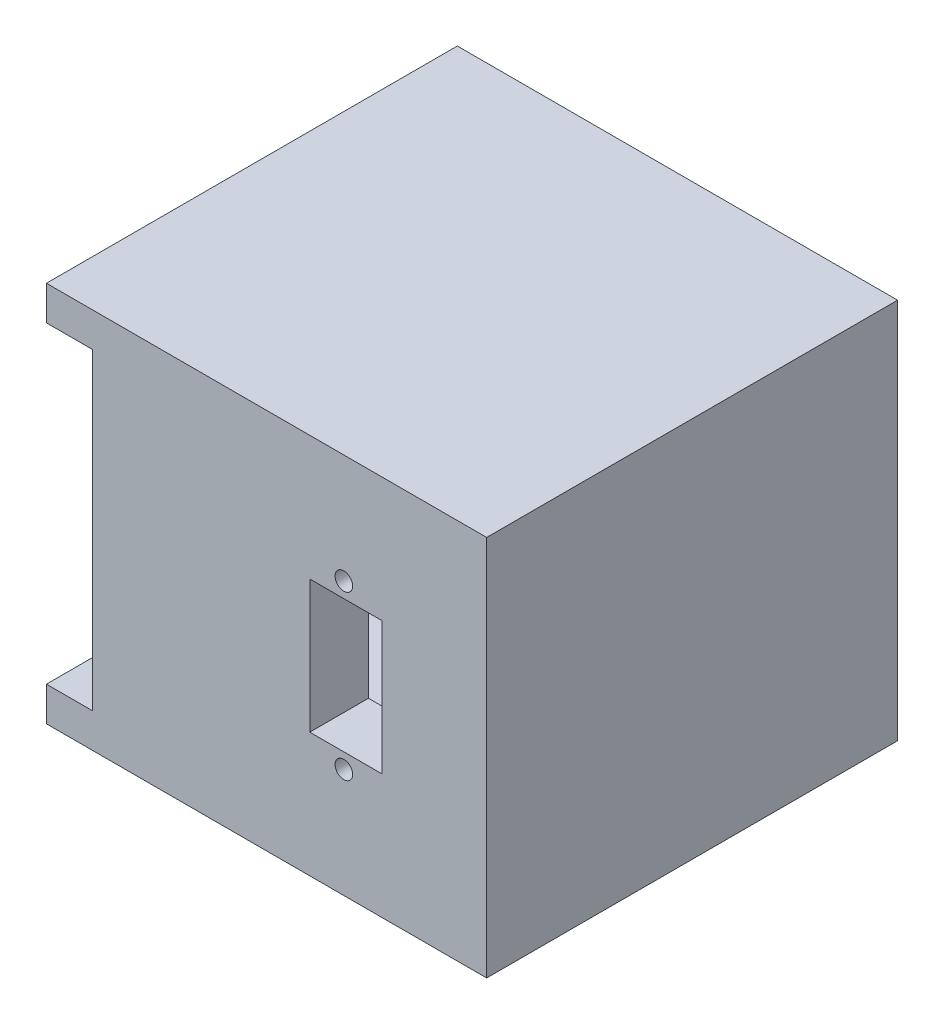
ISO-10303-21;
HEADER;
FILE_DESCRIPTION(('STEP AP214'),'2;1');
FILE_NAME('part.step','',(''),(''),'','','');
FILE_SCHEMA(('AUTOMOTIVE_DESIGN { 1 0 10303 214 1 1 1 1 }'));
ENDSEC;
DATA;
#1=APPLICATION_CONTEXT('core data for automotive mechanical design processes');
#2=APPLICATION_PROTOCOL_DEFINITION('international standard','automotive_design',2000,#1);
#3=PRODUCT_CONTEXT('',#1,'mechanical');
#4=PRODUCT('Part','Part','',(#3));
#5=PRODUCT_RELATED_PRODUCT_CATEGORY('part','',(#4));
#6=PRODUCT_DEFINITION_FORMATION('','',#4);
#7=PRODUCT_DEFINITION_CONTEXT('part definition',#1,'design');
#8=PRODUCT_DEFINITION('design','',#6,#7);
#9=PRODUCT_DEFINITION_SHAPE('','',#8);
#10=(LENGTH_UNIT() NAMED_UNIT(*) SI_UNIT(.MILLI.,.METRE.));
#11=(NAMED_UNIT(*) PLANE_ANGLE_UNIT() SI_UNIT($,.RADIAN.));
#12=(NAMED_UNIT(*) SI_UNIT($,.STERADIAN.) SOLID_ANGLE_UNIT());
#13=UNCERTAINTY_MEASURE_WITH_UNIT(LENGTH_MEASURE(1.E-05),#10,'distance_accuracy_value','');
#14=(GEOMETRIC_REPRESENTATION_CONTEXT(3) GLOBAL_UNCERTAINTY_ASSIGNED_CONTEXT((#13)) GLOBAL_UNIT_ASSIGNED_CONTEXT((#10,
#11,#12)) REPRESENTATION_CONTEXT('',''));
#15=CARTESIAN_POINT('',(0.,0.,0.));
#16=DIRECTION('',(0.,0.,1.));
#17=DIRECTION('',(1.,0.,0.));
#18=AXIS2_PLACEMENT_3D('',#15,#16,#17);
#19=CARTESIAN_POINT('',(0.,0.,70.));
#20=DIRECTION('',(1.,0.,0.));
#21=DIRECTION('',(0.,0.,-1.));
#22=AXIS2_PLACEMENT_3D('',#19,#20,#21);
#23=PLANE('',#22);
#24=CARTESIAN_POINT('',(0.,62.075,67.075));
#25=DIRECTION('',(-1.,0.,0.));
#26=DIRECTION('',(0.,0.,1.));
#27=AXIS2_PLACEMENT_3D('',#24,#25,#26);
#28=CIRCLE('',#27,1.49999999999999);
#29=CARTESIAN_POINT('',(0.,62.075,68.575));
#30=VERTEX_POINT('',#29);
#31=EDGE_CURVE('E211',#30,#30,#28,.T.);
#32=ORIENTED_EDGE('',*,*,#31,.F.);
#33=EDGE_LOOP('',(#32));
#34=FACE_BOUND('',#33,.T.);
#35=CARTESIAN_POINT('',(0.,2.925,67.075));
#36=DIRECTION('',(-1.,0.,0.));
#37=DIRECTION('',(0.,0.,1.));
#38=AXIS2_PLACEMENT_3D('',#35,#36,#37);
#39=CIRCLE('',#38,1.49999999999999);
#40=CARTESIAN_POINT('',(0.,2.925,68.575));
#41=VERTEX_POINT('',#40);
#42=EDGE_CURVE('E214',#41,#41,#39,.T.);
#43=ORIENTED_EDGE('',*,*,#42,.F.);
#44=EDGE_LOOP('',(#43));
#45=FACE_BOUND('',#44,.T.);
#46=CARTESIAN_POINT('',(0.,2.925,2.925));
#47=DIRECTION('',(-1.,0.,0.));
#48=DIRECTION('',(0.,0.,1.));
#49=AXIS2_PLACEMENT_3D('',#46,#47,#48);
#50=CIRCLE('',#49,1.49999999999999);
#51=CARTESIAN_POINT('',(0.,2.925,4.42499999999999));
#52=VERTEX_POINT('',#51);
#53=EDGE_CURVE('E224',#52,#52,#50,.T.);
#54=ORIENTED_EDGE('',*,*,#53,.F.);
#55=EDGE_LOOP('',(#54));
#56=FACE_BOUND('',#55,.T.);
#57=DIRECTION('',(0.,-1.,0.));
#58=VECTOR('',#57,1.);
#59=CARTESIAN_POINT('',(0.,0.,70.));
#60=LINE('',#59,#58);
#61=CARTESIAN_POINT('',(0.,5.85,70.));
#62=VERTEX_POINT('',#61);
#63=CARTESIAN_POINT('',(0.,0.,70.));
#64=VERTEX_POINT('',#63);
#65=EDGE_CURVE('E377',#62,#64,#60,.T.);
#66=ORIENTED_EDGE('',*,*,#65,.F.);
#67=DIRECTION('',(0.,0.,1.));
#68=VECTOR('',#67,1.);
#69=CARTESIAN_POINT('',(0.,5.85,5.85000000000001));
#70=LINE('',#69,#68);
#71=CARTESIAN_POINT('',(0.,5.85,13.85));
#72=VERTEX_POINT('',#71);
#73=EDGE_CURVE('E359',#72,#62,#70,.T.);
#74=ORIENTED_EDGE('',*,*,#73,.F.);
#75=DIRECTION('',(0.,1.,0.));
#76=VECTOR('',#75,1.);
#77=CARTESIAN_POINT('',(0.,5.85,13.85));
#78=LINE('',#77,#76);
#79=CARTESIAN_POINT('',(0.,6.85000000000002,13.85));
#80=VERTEX_POINT('',#79);
#81=EDGE_CURVE('E302',#72,#80,#78,.T.);
#82=ORIENTED_EDGE('',*,*,#81,.T.);
#83=DIRECTION('',(0.,0.,-1.));
#84=VECTOR('',#83,1.);
#85=CARTESIAN_POINT('',(0.,6.85000000000002,13.85));
#86=LINE('',#85,#84);
#87=CARTESIAN_POINT('',(0.,6.85000000000002,10.85));
#88=VERTEX_POINT('',#87);
#89=EDGE_CURVE('E331',#80,#88,#86,.T.);
#90=ORIENTED_EDGE('',*,*,#89,.T.);
#91=DIRECTION('',(0.,-1.,0.));
#92=VECTOR('',#91,1.);
#93=CARTESIAN_POINT('',(0.,5.85,10.85));
#94=LINE('',#93,#92);
#95=CARTESIAN_POINT('',(0.,5.85,10.85));
#96=VERTEX_POINT('',#95);
#97=EDGE_CURVE('E325',#88,#96,#94,.T.);
#98=ORIENTED_EDGE('',*,*,#97,.T.);
#99=CARTESIAN_POINT('',(0.,5.85,5.85000000000001));
#100=VERTEX_POINT('',#99);
#101=EDGE_CURVE('E363',#100,#96,#70,.T.);
#102=ORIENTED_EDGE('',*,*,#101,.F.);
#103=DIRECTION('',(0.,-1.,0.));
#104=VECTOR('',#103,1.);
#105=CARTESIAN_POINT('',(0.,59.15,5.85));
#106=LINE('',#105,#104);
#107=CARTESIAN_POINT('',(0.,59.15,5.85));
#108=VERTEX_POINT('',#107);
#109=EDGE_CURVE('E357',#108,#100,#106,.T.);
#110=ORIENTED_EDGE('',*,*,#109,.F.);
#111=DIRECTION('',(0.,0.,-1.));
#112=VECTOR('',#111,1.);
#113=CARTESIAN_POINT('',(0.,59.15,60.));
#114=LINE('',#113,#112);
#115=CARTESIAN_POINT('',(0.,59.15,10.85));
#116=VERTEX_POINT('',#115);
#117=EDGE_CURVE('E299',#116,#108,#114,.T.);
#118=ORIENTED_EDGE('',*,*,#117,.F.);
#119=DIRECTION('',(0.,-1.,0.));
#120=VECTOR('',#119,1.);
#121=CARTESIAN_POINT('',(0.,59.15,10.85));
#122=LINE('',#121,#120);
#123=CARTESIAN_POINT('',(0.,58.15,10.85));
#124=VERTEX_POINT('',#123);
#125=EDGE_CURVE('E303',#116,#124,#122,.T.);
#126=ORIENTED_EDGE('',*,*,#125,.T.);
#127=DIRECTION('',(0.,0.,1.));
#128=VECTOR('',#127,1.);
#129=CARTESIAN_POINT('',(0.,58.15,13.85));
#130=LINE('',#129,#128);
#131=CARTESIAN_POINT('',(0.,58.15,13.85));
#132=VERTEX_POINT('',#131);
#133=EDGE_CURVE('E310',#124,#132,#130,.T.);
#134=ORIENTED_EDGE('',*,*,#133,.T.);
#135=DIRECTION('',(0.,1.,0.));
#136=VECTOR('',#135,1.);
#137=CARTESIAN_POINT('',(0.,59.15,13.85));
#138=LINE('',#137,#136);
#139=CARTESIAN_POINT('',(0.,59.15,13.85));
#140=VERTEX_POINT('',#139);
#141=EDGE_CURVE('E297',#132,#140,#138,.T.);
#142=ORIENTED_EDGE('',*,*,#141,.T.);
#143=CARTESIAN_POINT('',(0.,59.15,70.));
#144=VERTEX_POINT('',#143);
#145=EDGE_CURVE('E352',#144,#140,#114,.T.);
#146=ORIENTED_EDGE('',*,*,#145,.F.);
#147=CARTESIAN_POINT('',(0.,65.,70.));
#148=VERTEX_POINT('',#147);
#149=EDGE_CURVE('E372',#148,#144,#60,.T.);
#150=ORIENTED_EDGE('',*,*,#149,.F.);
#151=DIRECTION('',(0.,0.,-1.));
#152=VECTOR('',#151,1.);
#153=CARTESIAN_POINT('',(0.,65.,70.));
#154=LINE('',#153,#152);
#155=CARTESIAN_POINT('',(0.,65.,0.));
#156=VERTEX_POINT('',#155);
#157=EDGE_CURVE('E381',#148,#156,#154,.T.);
#158=ORIENTED_EDGE('',*,*,#157,.T.);
#159=DIRECTION('',(0.,-1.,0.));
#160=VECTOR('',#159,1.);
#161=CARTESIAN_POINT('',(0.,0.,0.));
#162=LINE('',#161,#160);
#163=CARTESIAN_POINT('',(0.,0.,0.));
#164=VERTEX_POINT('',#163);
#165=EDGE_CURVE('E366',#156,#164,#162,.T.);
#166=ORIENTED_EDGE('',*,*,#165,.T.);
#167=DIRECTION('',(0.,0.,-1.));
#168=VECTOR('',#167,1.);
#169=CARTESIAN_POINT('',(0.,0.,70.));
#170=LINE('',#169,#168);
#171=EDGE_CURVE('E11',#64,#164,#170,.T.);
#172=ORIENTED_EDGE('',*,*,#171,.F.);
#173=EDGE_LOOP('',(#66,#74,#82,#90,#98,#102,#110,#118,#126,#134,#142,#146,#150,#158,#166,#172));
#174=FACE_BOUND('',#173,.T.);
#175=CARTESIAN_POINT('',(0.,62.075,2.925));
#176=DIRECTION('',(-1.,0.,0.));
#177=DIRECTION('',(0.,0.,1.));
#178=AXIS2_PLACEMENT_3D('',#175,#176,#177);
#179=CIRCLE('',#178,1.49999999999999);
#180=CARTESIAN_POINT('',(0.,62.075,4.42499999999999));
#181=VERTEX_POINT('',#180);
#182=EDGE_CURVE('E229',#181,#181,#179,.T.);
#183=ORIENTED_EDGE('',*,*,#182,.F.);
#184=EDGE_LOOP('',(#183));
#185=FACE_BOUND('',#184,.T.);
#186=ADVANCED_FACE('F39',(#34,#45,#56,#174,#185),#23,.F.);
#187=CARTESIAN_POINT('',(73.,5.85000000000002,60.));
#188=DIRECTION('',(0.,0.,1.));
#189=DIRECTION('',(0.,-1.,0.));
#190=AXIS2_PLACEMENT_3D('',#187,#188,#189);
#191=PLANE('',#190);
#192=DIRECTION('',(1.,0.,0.));
#193=VECTOR('',#192,1.);
#194=CARTESIAN_POINT('',(44.8637303891582,43.8,60.));
#195=LINE('',#194,#193);
#196=CARTESIAN_POINT('',(44.8637303891582,43.8,60.));
#197=VERTEX_POINT('',#196);
#198=CARTESIAN_POINT('',(57.1637303891582,43.8,60.));
#199=VERTEX_POINT('',#198);
#200=EDGE_CURVE('E251',#197,#199,#195,.T.);
#201=ORIENTED_EDGE('',*,*,#200,.F.);
#202=DIRECTION('',(0.,1.,0.));
#203=VECTOR('',#202,1.);
#204=CARTESIAN_POINT('',(44.8637303891582,43.8,60.));
#205=LINE('',#204,#203);
#206=CARTESIAN_POINT('',(44.8637303891582,21.2,60.));
#207=VERTEX_POINT('',#206);
#208=EDGE_CURVE('E239',#207,#197,#205,.T.);
#209=ORIENTED_EDGE('',*,*,#208,.F.);
#210=DIRECTION('',(-1.,0.,0.));
#211=VECTOR('',#210,1.);
#212=CARTESIAN_POINT('',(44.8637303891582,21.2,60.));
#213=LINE('',#212,#211);
#214=CARTESIAN_POINT('',(57.1637303891582,21.2,60.));
#215=VERTEX_POINT('',#214);
#216=EDGE_CURVE('E240',#215,#207,#213,.T.);
#217=ORIENTED_EDGE('',*,*,#216,.F.);
#218=DIRECTION('',(0.,-1.,0.));
#219=VECTOR('',#218,1.);
#220=CARTESIAN_POINT('',(57.1637303891582,43.8,60.));
#221=LINE('',#220,#219);
#222=EDGE_CURVE('E52',#199,#215,#221,.T.);
#223=ORIENTED_EDGE('',*,*,#222,.F.);
#224=EDGE_LOOP('',(#201,#209,#217,#223));
#225=FACE_BOUND('',#224,.T.);
#226=DIRECTION('',(0.,-1.,0.));
#227=VECTOR('',#226,1.);
#228=CARTESIAN_POINT('',(7.81226040167685,59.15,60.));
#229=LINE('',#228,#227);
#230=CARTESIAN_POINT('',(7.81226040167685,59.15,60.));
#231=VERTEX_POINT('',#230);
#232=CARTESIAN_POINT('',(7.81226040167684,5.85,60.));
#233=VERTEX_POINT('',#232);
#234=EDGE_CURVE('E282',#231,#233,#229,.T.);
#235=ORIENTED_EDGE('',*,*,#234,.F.);
#236=DIRECTION('',(-1.,0.,0.));
#237=VECTOR('',#236,1.);
#238=CARTESIAN_POINT('',(73.,59.15,60.));
#239=LINE('',#238,#237);
#240=CARTESIAN_POINT('',(73.,59.15,60.));
#241=VERTEX_POINT('',#240);
#242=EDGE_CURVE('E361',#241,#231,#239,.T.);
#243=ORIENTED_EDGE('',*,*,#242,.F.);
#244=DIRECTION('',(0.,1.,0.));
#245=VECTOR('',#244,1.);
#246=CARTESIAN_POINT('',(73.,5.85000000000002,60.));
#247=LINE('',#246,#245);
#248=CARTESIAN_POINT('',(73.,5.85000000000002,60.));
#249=VERTEX_POINT('',#248);
#250=EDGE_CURVE('E353',#249,#241,#247,.T.);
#251=ORIENTED_EDGE('',*,*,#250,.F.);
#252=DIRECTION('',(-1.,0.,0.));
#253=VECTOR('',#252,1.);
#254=CARTESIAN_POINT('',(73.,5.85000000000002,60.));
#255=LINE('',#254,#253);
#256=EDGE_CURVE('E370',#249,#233,#255,.T.);
#257=ORIENTED_EDGE('',*,*,#256,.T.);
#258=EDGE_LOOP('',(#235,#243,#251,#257));
#259=FACE_BOUND('',#258,.T.);
#260=ADVANCED_FACE('F479',(#225,#259),#191,.F.);
#261=CARTESIAN_POINT('',(73.,59.15,60.));
#262=DIRECTION('',(0.,1.,0.));
#263=DIRECTION('',(0.,0.,1.));
#264=AXIS2_PLACEMENT_3D('',#261,#262,#263);
#265=PLANE('',#264);
#266=DIRECTION('',(-1.,0.,0.));
#267=VECTOR('',#266,1.);
#268=CARTESIAN_POINT('',(76.1622776601684,59.15,13.85));
#269=LINE('',#268,#267);
#270=CARTESIAN_POINT('',(73.,59.15,13.85));
#271=VERTEX_POINT('',#270);
#272=EDGE_CURVE('E309',#271,#140,#269,.T.);
#273=ORIENTED_EDGE('',*,*,#272,.F.);
#274=DIRECTION('',(0.,0.,-1.));
#275=VECTOR('',#274,1.);
#276=CARTESIAN_POINT('',(73.,59.15,60.));
#277=LINE('',#276,#275);
#278=EDGE_CURVE('E338',#241,#271,#277,.T.);
#279=ORIENTED_EDGE('',*,*,#278,.F.);
#280=ORIENTED_EDGE('',*,*,#242,.T.);
#281=DIRECTION('',(0.,0.,-1.));
#282=VECTOR('',#281,1.);
#283=CARTESIAN_POINT('',(7.81226040167685,59.15,70.001));
#284=LINE('',#283,#282);
#285=CARTESIAN_POINT('',(7.81226040167685,59.15,70.));
#286=VERTEX_POINT('',#285);
#287=EDGE_CURVE('E284',#286,#231,#284,.T.);
#288=ORIENTED_EDGE('',*,*,#287,.F.);
#289=DIRECTION('',(1.,0.,0.));
#290=VECTOR('',#289,1.);
#291=CARTESIAN_POINT('',(7.81226040167685,59.15,70.));
#292=LINE('',#291,#290);
#293=EDGE_CURVE('E279',#144,#286,#292,.T.);
#294=ORIENTED_EDGE('',*,*,#293,.F.);
#295=ORIENTED_EDGE('',*,*,#145,.T.);
#296=EDGE_LOOP('',(#273,#279,#280,#288,#294,#295));
#297=FACE_BOUND('',#296,.T.);
#298=ADVANCED_FACE('F474',(#297),#265,.F.);
#299=CARTESIAN_POINT('',(73.,5.85000000000002,5.85000000000001));
#300=DIRECTION('',(0.,-1.,0.));
#301=DIRECTION('',(1.,0.,0.));
#302=AXIS2_PLACEMENT_3D('',#299,#300,#301);
#303=PLANE('',#302);
#304=DIRECTION('',(-1.,0.,0.));
#305=VECTOR('',#304,1.);
#306=CARTESIAN_POINT('',(76.1622776601684,5.85000000000002,10.85));
#307=LINE('',#306,#305);
#308=CARTESIAN_POINT('',(73.,5.85000000000002,10.85));
#309=VERTEX_POINT('',#308);
#310=EDGE_CURVE('E323',#309,#96,#307,.T.);
#311=ORIENTED_EDGE('',*,*,#310,.F.);
#312=DIRECTION('',(0.,0.,1.));
#313=VECTOR('',#312,1.);
#314=CARTESIAN_POINT('',(73.,5.85000000000002,5.85000000000001));
#315=LINE('',#314,#313);
#316=CARTESIAN_POINT('',(73.,5.85000000000002,5.85000000000001));
#317=VERTEX_POINT('',#316);
#318=EDGE_CURVE('E348',#317,#309,#315,.T.);
#319=ORIENTED_EDGE('',*,*,#318,.F.);
#320=DIRECTION('',(-1.,0.,0.));
#321=VECTOR('',#320,1.);
#322=CARTESIAN_POINT('',(73.,5.85000000000002,5.85000000000001));
#323=LINE('',#322,#321);
#324=EDGE_CURVE('E369',#317,#100,#323,.T.);
#325=ORIENTED_EDGE('',*,*,#324,.T.);
#326=ORIENTED_EDGE('',*,*,#101,.T.);
#327=EDGE_LOOP('',(#311,#319,#325,#326));
#328=FACE_BOUND('',#327,.T.);
#329=ADVANCED_FACE('F447',(#328),#303,.F.);
#330=CARTESIAN_POINT('',(73.,0.,0.));
#331=DIRECTION('',(-1.,0.,0.));
#332=DIRECTION('',(0.,-1.,0.));
#333=AXIS2_PLACEMENT_3D('',#330,#331,#332);
#334=PLANE('',#333);
#335=ORIENTED_EDGE('',*,*,#278,.T.);
#336=DIRECTION('',(0.,-1.,0.));
#337=VECTOR('',#336,1.);
#338=CARTESIAN_POINT('',(73.,59.15,13.85));
#339=LINE('',#338,#337);
#340=CARTESIAN_POINT('',(73.,58.15,13.85));
#341=VERTEX_POINT('',#340);
#342=EDGE_CURVE('E300',#271,#341,#339,.T.);
#343=ORIENTED_EDGE('',*,*,#342,.T.);
#344=DIRECTION('',(0.,0.,-1.));
#345=VECTOR('',#344,1.);
#346=CARTESIAN_POINT('',(73.,58.15,13.85));
#347=LINE('',#346,#345);
#348=CARTESIAN_POINT('',(73.,58.15,10.85));
#349=VERTEX_POINT('',#348);
#350=EDGE_CURVE('E295',#341,#349,#347,.T.);
#351=ORIENTED_EDGE('',*,*,#350,.T.);
#352=DIRECTION('',(0.,1.,0.));
#353=VECTOR('',#352,1.);
#354=CARTESIAN_POINT('',(73.,59.15,10.85));
#355=LINE('',#354,#353);
#356=CARTESIAN_POINT('',(73.,59.15,10.85));
#357=VERTEX_POINT('',#356);
#358=EDGE_CURVE('E292',#349,#357,#355,.T.);
#359=ORIENTED_EDGE('',*,*,#358,.T.);
#360=CARTESIAN_POINT('',(73.,59.15,5.85));
#361=VERTEX_POINT('',#360);
#362=EDGE_CURVE('E341',#357,#361,#277,.T.);
#363=ORIENTED_EDGE('',*,*,#362,.T.);
#364=DIRECTION('',(0.,-1.,0.));
#365=VECTOR('',#364,1.);
#366=CARTESIAN_POINT('',(73.,59.15,5.85));
#367=LINE('',#366,#365);
#368=EDGE_CURVE('E344',#361,#317,#367,.T.);
#369=ORIENTED_EDGE('',*,*,#368,.T.);
#370=ORIENTED_EDGE('',*,*,#318,.T.);
#371=DIRECTION('',(0.,1.,0.));
#372=VECTOR('',#371,1.);
#373=CARTESIAN_POINT('',(73.,5.85000000000002,10.85));
#374=LINE('',#373,#372);
#375=CARTESIAN_POINT('',(73.,6.85000000000003,10.85));
#376=VERTEX_POINT('',#375);
#377=EDGE_CURVE('E326',#309,#376,#374,.T.);
#378=ORIENTED_EDGE('',*,*,#377,.T.);
#379=DIRECTION('',(0.,0.,1.));
#380=VECTOR('',#379,1.);
#381=CARTESIAN_POINT('',(73.,6.85000000000003,13.85));
#382=LINE('',#381,#380);
#383=CARTESIAN_POINT('',(73.,6.85000000000003,13.85));
#384=VERTEX_POINT('',#383);
#385=EDGE_CURVE('E293',#376,#384,#382,.T.);
#386=ORIENTED_EDGE('',*,*,#385,.T.);
#387=DIRECTION('',(0.,-1.,0.));
#388=VECTOR('',#387,1.);
#389=CARTESIAN_POINT('',(73.,5.85000000000002,13.85));
#390=LINE('',#389,#388);
#391=CARTESIAN_POINT('',(73.,5.85000000000002,13.85));
#392=VERTEX_POINT('',#391);
#393=EDGE_CURVE('E316',#384,#392,#390,.T.);
#394=ORIENTED_EDGE('',*,*,#393,.T.);
#395=EDGE_CURVE('E350',#392,#249,#315,.T.);
#396=ORIENTED_EDGE('',*,*,#395,.T.);
#397=ORIENTED_EDGE('',*,*,#250,.T.);
#398=EDGE_LOOP('',(#335,#343,#351,#359,#363,#369,#370,#378,#386,#394,#396,#397));
#399=FACE_BOUND('',#398,.T.);
#400=ADVANCED_FACE('F449',(#399),#334,.T.);
#401=CARTESIAN_POINT('',(0.,0.,70.));
#402=DIRECTION('',(0.,1.,0.));
#403=DIRECTION('',(0.,0.,1.));
#404=AXIS2_PLACEMENT_3D('',#401,#402,#403);
#405=PLANE('',#404);
#406=DIRECTION('',(1.,0.,0.));
#407=VECTOR('',#406,1.);
#408=CARTESIAN_POINT('',(0.,0.,0.));
#409=LINE('',#408,#407);
#410=CARTESIAN_POINT('',(75.,0.,0.));
#411=VERTEX_POINT('',#410);
#412=EDGE_CURVE('E390',#164,#411,#409,.T.);
#413=ORIENTED_EDGE('',*,*,#412,.T.);
#414=DIRECTION('',(0.,0.,-1.));
#415=VECTOR('',#414,1.);
#416=CARTESIAN_POINT('',(75.,0.,70.));
#417=LINE('',#416,#415);
#418=CARTESIAN_POINT('',(75.,0.,70.));
#419=VERTEX_POINT('',#418);
#420=EDGE_CURVE('E46',#419,#411,#417,.T.);
#421=ORIENTED_EDGE('',*,*,#420,.F.);
#422=DIRECTION('',(1.,0.,0.));
#423=VECTOR('',#422,1.);
#424=CARTESIAN_POINT('',(0.,0.,70.));
#425=LINE('',#424,#423);
#426=EDGE_CURVE('E380',#64,#419,#425,.T.);
#427=ORIENTED_EDGE('',*,*,#426,.F.);
#428=ORIENTED_EDGE('',*,*,#171,.T.);
#429=EDGE_LOOP('',(#413,#421,#427,#428));
#430=FACE_BOUND('',#429,.T.);
#431=ADVANCED_FACE('F425',(#430),#405,.F.);
#432=CARTESIAN_POINT('',(75.,0.,70.));
#433=DIRECTION('',(-1.,0.,0.));
#434=DIRECTION('',(0.,-1.,0.));
#435=AXIS2_PLACEMENT_3D('',#432,#433,#434);
#436=PLANE('',#435);
#437=DIRECTION('',(0.,1.,0.));
#438=VECTOR('',#437,1.);
#439=CARTESIAN_POINT('',(75.,0.,0.));
#440=LINE('',#439,#438);
#441=CARTESIAN_POINT('',(75.,65.,0.));
#442=VERTEX_POINT('',#441);
#443=EDGE_CURVE('E386',#411,#442,#440,.T.);
#444=ORIENTED_EDGE('',*,*,#443,.T.);
#445=DIRECTION('',(0.,0.,-1.));
#446=VECTOR('',#445,1.);
#447=CARTESIAN_POINT('',(75.,65.,70.));
#448=LINE('',#447,#446);
#449=CARTESIAN_POINT('',(75.,65.,70.));
#450=VERTEX_POINT('',#449);
#451=EDGE_CURVE('E391',#450,#442,#448,.T.);
#452=ORIENTED_EDGE('',*,*,#451,.F.);
#453=DIRECTION('',(0.,1.,0.));
#454=VECTOR('',#453,1.);
#455=CARTESIAN_POINT('',(75.,0.,70.));
#456=LINE('',#455,#454);
#457=EDGE_CURVE('E379',#419,#450,#456,.T.);
#458=ORIENTED_EDGE('',*,*,#457,.F.);
#459=ORIENTED_EDGE('',*,*,#420,.T.);
#460=EDGE_LOOP('',(#444,#452,#458,#459));
#461=FACE_BOUND('',#460,.T.);
#462=ADVANCED_FACE('F405',(#461),#436,.F.);
#463=CARTESIAN_POINT('',(0.,65.,70.));
#464=DIRECTION('',(0.,-1.,0.));
#465=DIRECTION('',(0.,0.,-1.));
#466=AXIS2_PLACEMENT_3D('',#463,#464,#465);
#467=PLANE('',#466);
#468=DIRECTION('',(-1.,0.,0.));
#469=VECTOR('',#468,1.);
#470=CARTESIAN_POINT('',(0.,65.,0.));
#471=LINE('',#470,#469);
#472=EDGE_CURVE('E392',#442,#156,#471,.T.);
#473=ORIENTED_EDGE('',*,*,#472,.T.);
#474=ORIENTED_EDGE('',*,*,#157,.F.);
#475=DIRECTION('',(-1.,0.,0.));
#476=VECTOR('',#475,1.);
#477=CARTESIAN_POINT('',(0.,65.,70.));
#478=LINE('',#477,#476);
#479=EDGE_CURVE('E385',#450,#148,#478,.T.);
#480=ORIENTED_EDGE('',*,*,#479,.F.);
#481=ORIENTED_EDGE('',*,*,#451,.T.);
#482=EDGE_LOOP('',(#473,#474,#480,#481));
#483=FACE_BOUND('',#482,.T.);
#484=ADVANCED_FACE('F415',(#483),#467,.F.);
#485=CARTESIAN_POINT('',(0.,0.,70.));
#486=DIRECTION('',(0.,0.,-1.));
#487=DIRECTION('',(-1.,0.,0.));
#488=AXIS2_PLACEMENT_3D('',#485,#486,#487);
#489=PLANE('',#488);
#490=DIRECTION('',(1.,0.,0.));
#491=VECTOR('',#490,1.);
#492=CARTESIAN_POINT('',(44.8637303891582,21.2,70.));
#493=LINE('',#492,#491);
#494=CARTESIAN_POINT('',(44.8637303891582,21.2,70.));
#495=VERTEX_POINT('',#494);
#496=CARTESIAN_POINT('',(57.1637303891582,21.2,70.));
#497=VERTEX_POINT('',#496);
#498=EDGE_CURVE('E250',#495,#497,#493,.T.);
#499=ORIENTED_EDGE('',*,*,#498,.F.);
#500=DIRECTION('',(0.,-1.,0.));
#501=VECTOR('',#500,1.);
#502=CARTESIAN_POINT('',(44.8637303891582,43.8,70.));
#503=LINE('',#502,#501);
#504=CARTESIAN_POINT('',(44.8637303891582,43.8,70.));
#505=VERTEX_POINT('',#504);
#506=EDGE_CURVE('E62',#505,#495,#503,.T.);
#507=ORIENTED_EDGE('',*,*,#506,.F.);
#508=DIRECTION('',(-1.,0.,0.));
#509=VECTOR('',#508,1.);
#510=CARTESIAN_POINT('',(44.8637303891582,43.8,70.));
#511=LINE('',#510,#509);
#512=CARTESIAN_POINT('',(57.1637303891582,43.8,70.));
#513=VERTEX_POINT('',#512);
#514=EDGE_CURVE('E241',#513,#505,#511,.T.);
#515=ORIENTED_EDGE('',*,*,#514,.F.);
#516=DIRECTION('',(0.,1.,0.));
#517=VECTOR('',#516,1.);
#518=CARTESIAN_POINT('',(57.1637303891582,43.8,70.));
#519=LINE('',#518,#517);
#520=EDGE_CURVE('E242',#497,#513,#519,.T.);
#521=ORIENTED_EDGE('',*,*,#520,.F.);
#522=EDGE_LOOP('',(#499,#507,#515,#521));
#523=FACE_BOUND('',#522,.T.);
#524=CARTESIAN_POINT('',(50.6697039557872,46.4,70.));
#525=DIRECTION('',(0.,0.,1.));
#526=DIRECTION('',(1.,0.,0.));
#527=AXIS2_PLACEMENT_3D('',#524,#525,#526);
#528=CIRCLE('',#527,1.5);
#529=CARTESIAN_POINT('',(52.1697039557872,46.4,70.));
#530=VERTEX_POINT('',#529);
#531=EDGE_CURVE('E259',#530,#530,#528,.T.);
#532=ORIENTED_EDGE('',*,*,#531,.F.);
#533=EDGE_LOOP('',(#532));
#534=FACE_BOUND('',#533,.T.);
#535=CARTESIAN_POINT('',(50.6697039557872,18.6,70.));
#536=DIRECTION('',(0.,0.,1.));
#537=DIRECTION('',(1.,0.,0.));
#538=AXIS2_PLACEMENT_3D('',#535,#536,#537);
#539=CIRCLE('',#538,1.5);
#540=CARTESIAN_POINT('',(52.1697039557872,18.6,70.));
#541=VERTEX_POINT('',#540);
#542=EDGE_CURVE('E267',#541,#541,#539,.T.);
#543=ORIENTED_EDGE('',*,*,#542,.F.);
#544=EDGE_LOOP('',(#543));
#545=FACE_BOUND('',#544,.T.);
#546=ORIENTED_EDGE('',*,*,#149,.T.);
#547=ORIENTED_EDGE('',*,*,#293,.T.);
#548=DIRECTION('',(0.,1.,0.));
#549=VECTOR('',#548,1.);
#550=CARTESIAN_POINT('',(7.81226040167685,59.15,70.));
#551=LINE('',#550,#549);
#552=CARTESIAN_POINT('',(7.81226040167684,5.85,70.));
#553=VERTEX_POINT('',#552);
#554=EDGE_CURVE('E286',#553,#286,#551,.T.);
#555=ORIENTED_EDGE('',*,*,#554,.F.);
#556=DIRECTION('',(1.,0.,0.));
#557=VECTOR('',#556,1.);
#558=CARTESIAN_POINT('',(7.81226040167684,5.85,70.));
#559=LINE('',#558,#557);
#560=EDGE_CURVE('E277',#62,#553,#559,.T.);
#561=ORIENTED_EDGE('',*,*,#560,.F.);
#562=ORIENTED_EDGE('',*,*,#65,.T.);
#563=ORIENTED_EDGE('',*,*,#426,.T.);
#564=ORIENTED_EDGE('',*,*,#457,.T.);
#565=ORIENTED_EDGE('',*,*,#479,.T.);
#566=EDGE_LOOP('',(#546,#547,#555,#561,#562,#563,#564,#565));
#567=FACE_BOUND('',#566,.T.);
#568=ADVANCED_FACE('F423',(#523,#534,#545,#567),#489,.F.);
#569=CARTESIAN_POINT('',(0.,0.,0.));
#570=DIRECTION('',(0.,0.,-1.));
#571=DIRECTION('',(-1.,0.,0.));
#572=AXIS2_PLACEMENT_3D('',#569,#570,#571);
#573=PLANE('',#572);
#574=ORIENTED_EDGE('',*,*,#165,.F.);
#575=ORIENTED_EDGE('',*,*,#472,.F.);
#576=ORIENTED_EDGE('',*,*,#443,.F.);
#577=ORIENTED_EDGE('',*,*,#412,.F.);
#578=EDGE_LOOP('',(#574,#575,#576,#577));
#579=FACE_BOUND('',#578,.T.);
#580=ADVANCED_FACE('F406',(#579),#573,.T.);
#581=ORIENTED_EDGE('',*,*,#362,.F.);
#582=DIRECTION('',(-1.,0.,0.));
#583=VECTOR('',#582,1.);
#584=CARTESIAN_POINT('',(76.1622776601684,59.15,10.85));
#585=LINE('',#584,#583);
#586=EDGE_CURVE('E313',#357,#116,#585,.T.);
#587=ORIENTED_EDGE('',*,*,#586,.T.);
#588=ORIENTED_EDGE('',*,*,#117,.T.);
#589=DIRECTION('',(-1.,0.,0.));
#590=VECTOR('',#589,1.);
#591=CARTESIAN_POINT('',(73.,59.15,5.85));
#592=LINE('',#591,#590);
#593=EDGE_CURVE('E354',#361,#108,#592,.T.);
#594=ORIENTED_EDGE('',*,*,#593,.F.);
#595=EDGE_LOOP('',(#581,#587,#588,#594));
#596=FACE_BOUND('',#595,.T.);
#597=ADVANCED_FACE('F482',(#596),#265,.F.);
#598=ORIENTED_EDGE('',*,*,#395,.F.);
#599=DIRECTION('',(-1.,0.,0.));
#600=VECTOR('',#599,1.);
#601=CARTESIAN_POINT('',(76.1622776601684,5.85000000000002,13.85));
#602=LINE('',#601,#600);
#603=EDGE_CURVE('E328',#392,#72,#602,.T.);
#604=ORIENTED_EDGE('',*,*,#603,.T.);
#605=ORIENTED_EDGE('',*,*,#73,.T.);
#606=ORIENTED_EDGE('',*,*,#560,.T.);
#607=DIRECTION('',(0.,0.,-1.));
#608=VECTOR('',#607,1.);
#609=CARTESIAN_POINT('',(7.81226040167684,5.85,70.001));
#610=LINE('',#609,#608);
#611=EDGE_CURVE('E288',#553,#233,#610,.T.);
#612=ORIENTED_EDGE('',*,*,#611,.T.);
#613=ORIENTED_EDGE('',*,*,#256,.F.);
#614=EDGE_LOOP('',(#598,#604,#605,#606,#612,#613));
#615=FACE_BOUND('',#614,.T.);
#616=ADVANCED_FACE('F481',(#615),#303,.F.);
#617=CARTESIAN_POINT('',(73.,59.15,5.85));
#618=DIRECTION('',(0.,0.,-1.));
#619=DIRECTION('',(0.,1.,0.));
#620=AXIS2_PLACEMENT_3D('',#617,#618,#619);
#621=PLANE('',#620);
#622=ORIENTED_EDGE('',*,*,#109,.T.);
#623=ORIENTED_EDGE('',*,*,#324,.F.);
#624=ORIENTED_EDGE('',*,*,#368,.F.);
#625=ORIENTED_EDGE('',*,*,#593,.T.);
#626=EDGE_LOOP('',(#622,#623,#624,#625));
#627=FACE_BOUND('',#626,.T.);
#628=ADVANCED_FACE('F454',(#627),#621,.F.);
#629=CARTESIAN_POINT('',(76.1622776601684,5.85000000000002,13.85));
#630=DIRECTION('',(0.,0.,1.));
#631=DIRECTION('',(1.,0.,0.));
#632=AXIS2_PLACEMENT_3D('',#629,#630,#631);
#633=PLANE('',#632);
#634=ORIENTED_EDGE('',*,*,#393,.F.);
#635=DIRECTION('',(-1.,0.,0.));
#636=VECTOR('',#635,1.);
#637=CARTESIAN_POINT('',(76.1622776601684,6.85000000000003,13.85));
#638=LINE('',#637,#636);
#639=EDGE_CURVE('E318',#384,#80,#638,.T.);
#640=ORIENTED_EDGE('',*,*,#639,.T.);
#641=ORIENTED_EDGE('',*,*,#81,.F.);
#642=ORIENTED_EDGE('',*,*,#603,.F.);
#643=EDGE_LOOP('',(#634,#640,#641,#642));
#644=FACE_BOUND('',#643,.T.);
#645=ADVANCED_FACE('F431',(#644),#633,.T.);
#646=CARTESIAN_POINT('',(76.1622776601684,5.85000000000002,10.85));
#647=DIRECTION('',(0.,0.,-1.));
#648=DIRECTION('',(0.,1.,0.));
#649=AXIS2_PLACEMENT_3D('',#646,#647,#648);
#650=PLANE('',#649);
#651=ORIENTED_EDGE('',*,*,#377,.F.);
#652=ORIENTED_EDGE('',*,*,#310,.T.);
#653=ORIENTED_EDGE('',*,*,#97,.F.);
#654=DIRECTION('',(-1.,0.,0.));
#655=VECTOR('',#654,1.);
#656=CARTESIAN_POINT('',(76.1622776601684,6.85000000000003,10.85));
#657=LINE('',#656,#655);
#658=EDGE_CURVE('E324',#376,#88,#657,.T.);
#659=ORIENTED_EDGE('',*,*,#658,.F.);
#660=EDGE_LOOP('',(#651,#652,#653,#659));
#661=FACE_BOUND('',#660,.T.);
#662=ADVANCED_FACE('F442',(#661),#650,.T.);
#663=CARTESIAN_POINT('',(76.1622776601684,6.85000000000003,13.85));
#664=DIRECTION('',(0.,1.,0.));
#665=DIRECTION('',(-1.,0.,0.));
#666=AXIS2_PLACEMENT_3D('',#663,#664,#665);
#667=PLANE('',#666);
#668=ORIENTED_EDGE('',*,*,#385,.F.);
#669=ORIENTED_EDGE('',*,*,#658,.T.);
#670=ORIENTED_EDGE('',*,*,#89,.F.);
#671=ORIENTED_EDGE('',*,*,#639,.F.);
#672=EDGE_LOOP('',(#668,#669,#670,#671));
#673=FACE_BOUND('',#672,.T.);
#674=ADVANCED_FACE('F436',(#673),#667,.T.);
#675=CARTESIAN_POINT('',(76.1622776601684,59.15,13.85));
#676=DIRECTION('',(0.,0.,1.));
#677=DIRECTION('',(1.,0.,0.));
#678=AXIS2_PLACEMENT_3D('',#675,#676,#677);
#679=PLANE('',#678);
#680=ORIENTED_EDGE('',*,*,#342,.F.);
#681=ORIENTED_EDGE('',*,*,#272,.T.);
#682=ORIENTED_EDGE('',*,*,#141,.F.);
#683=DIRECTION('',(-1.,0.,0.));
#684=VECTOR('',#683,1.);
#685=CARTESIAN_POINT('',(76.1622776601684,58.15,13.85));
#686=LINE('',#685,#684);
#687=EDGE_CURVE('E294',#341,#132,#686,.T.);
#688=ORIENTED_EDGE('',*,*,#687,.F.);
#689=EDGE_LOOP('',(#680,#681,#682,#688));
#690=FACE_BOUND('',#689,.T.);
#691=ADVANCED_FACE('F468',(#690),#679,.T.);
#692=CARTESIAN_POINT('',(76.1622776601684,58.15,13.85));
#693=DIRECTION('',(0.,-1.,0.));
#694=DIRECTION('',(1.,0.,0.));
#695=AXIS2_PLACEMENT_3D('',#692,#693,#694);
#696=PLANE('',#695);
#697=ORIENTED_EDGE('',*,*,#350,.F.);
#698=ORIENTED_EDGE('',*,*,#687,.T.);
#699=ORIENTED_EDGE('',*,*,#133,.F.);
#700=DIRECTION('',(-1.,0.,0.));
#701=VECTOR('',#700,1.);
#702=CARTESIAN_POINT('',(76.1622776601684,58.15,10.85));
#703=LINE('',#702,#701);
#704=EDGE_CURVE('E315',#349,#124,#703,.T.);
#705=ORIENTED_EDGE('',*,*,#704,.F.);
#706=EDGE_LOOP('',(#697,#698,#699,#705));
#707=FACE_BOUND('',#706,.T.);
#708=ADVANCED_FACE('F462',(#707),#696,.T.);
#709=CARTESIAN_POINT('',(76.1622776601684,59.15,10.85));
#710=DIRECTION('',(0.,0.,-1.));
#711=DIRECTION('',(-1.,0.,0.));
#712=AXIS2_PLACEMENT_3D('',#709,#710,#711);
#713=PLANE('',#712);
#714=ORIENTED_EDGE('',*,*,#358,.F.);
#715=ORIENTED_EDGE('',*,*,#704,.T.);
#716=ORIENTED_EDGE('',*,*,#125,.F.);
#717=ORIENTED_EDGE('',*,*,#586,.F.);
#718=EDGE_LOOP('',(#714,#715,#716,#717));
#719=FACE_BOUND('',#718,.T.);
#720=ADVANCED_FACE('F463',(#719),#713,.T.);
#721=CARTESIAN_POINT('',(7.81226040167685,59.15,70.001));
#722=DIRECTION('',(1.,0.,0.));
#723=DIRECTION('',(0.,1.,0.));
#724=AXIS2_PLACEMENT_3D('',#721,#722,#723);
#725=PLANE('',#724);
#726=ORIENTED_EDGE('',*,*,#554,.T.);
#727=ORIENTED_EDGE('',*,*,#287,.T.);
#728=ORIENTED_EDGE('',*,*,#234,.T.);
#729=ORIENTED_EDGE('',*,*,#611,.F.);
#730=EDGE_LOOP('',(#726,#727,#728,#729));
#731=FACE_BOUND('',#730,.T.);
#732=ADVANCED_FACE('F485',(#731),#725,.F.);
#733=CARTESIAN_POINT('',(50.6697039557872,18.6,62.));
#734=DIRECTION('',(0.,0.,1.));
#735=DIRECTION('',(1.,0.,0.));
#736=AXIS2_PLACEMENT_3D('',#733,#734,#735);
#737=CONICAL_SURFACE('',#736,1.5,1.02974425867666);
#738=CARTESIAN_POINT('',(50.6697039557872,18.6,61.0987090714587));
#739=VERTEX_POINT('',#738);
#740=VERTEX_LOOP('',#739);
#741=FACE_BOUND('',#740,.T.);
#742=CARTESIAN_POINT('',(50.6697039557872,18.6,62.));
#743=DIRECTION('',(0.,0.,1.));
#744=DIRECTION('',(1.,0.,0.));
#745=AXIS2_PLACEMENT_3D('',#742,#743,#744);
#746=CIRCLE('',#745,1.5);
#747=CARTESIAN_POINT('',(52.1697039557872,18.6,62.));
#748=VERTEX_POINT('',#747);
#749=EDGE_CURVE('E271',#748,#748,#746,.T.);
#750=ORIENTED_EDGE('',*,*,#749,.T.);
#751=EDGE_LOOP('',(#750));
#752=FACE_BOUND('',#751,.T.);
#753=ADVANCED_FACE('F559',(#741,#752),#737,.F.);
#754=CARTESIAN_POINT('',(50.6697039557872,18.6,70.));
#755=DIRECTION('',(0.,0.,1.));
#756=DIRECTION('',(1.,0.,0.));
#757=AXIS2_PLACEMENT_3D('',#754,#755,#756);
#758=CYLINDRICAL_SURFACE('',#757,1.5);
#759=ORIENTED_EDGE('',*,*,#749,.F.);
#760=EDGE_LOOP('',(#759));
#761=FACE_BOUND('',#760,.T.);
#762=ORIENTED_EDGE('',*,*,#542,.T.);
#763=EDGE_LOOP('',(#762));
#764=FACE_BOUND('',#763,.T.);
#765=ADVANCED_FACE('F554',(#761,#764),#758,.F.);
#766=CARTESIAN_POINT('',(50.6697039557872,46.4,62.));
#767=DIRECTION('',(0.,0.,1.));
#768=DIRECTION('',(1.,0.,0.));
#769=AXIS2_PLACEMENT_3D('',#766,#767,#768);
#770=CONICAL_SURFACE('',#769,1.5,1.02974425867666);
#771=CARTESIAN_POINT('',(50.6697039557872,46.4,61.0987090714587));
#772=VERTEX_POINT('',#771);
#773=VERTEX_LOOP('',#772);
#774=FACE_BOUND('',#773,.T.);
#775=CARTESIAN_POINT('',(50.6697039557872,46.4,62.));
#776=DIRECTION('',(0.,0.,1.));
#777=DIRECTION('',(1.,0.,0.));
#778=AXIS2_PLACEMENT_3D('',#775,#776,#777);
#779=CIRCLE('',#778,1.5);
#780=CARTESIAN_POINT('',(52.1697039557872,46.4,62.));
#781=VERTEX_POINT('',#780);
#782=EDGE_CURVE('E270',#781,#781,#779,.T.);
#783=ORIENTED_EDGE('',*,*,#782,.T.);
#784=EDGE_LOOP('',(#783));
#785=FACE_BOUND('',#784,.T.);
#786=ADVANCED_FACE('F553',(#774,#785),#770,.F.);
#787=CARTESIAN_POINT('',(50.6697039557872,46.4,70.));
#788=DIRECTION('',(0.,0.,1.));
#789=DIRECTION('',(1.,0.,0.));
#790=AXIS2_PLACEMENT_3D('',#787,#788,#789);
#791=CYLINDRICAL_SURFACE('',#790,1.5);
#792=ORIENTED_EDGE('',*,*,#782,.F.);
#793=EDGE_LOOP('',(#792));
#794=FACE_BOUND('',#793,.T.);
#795=ORIENTED_EDGE('',*,*,#531,.T.);
#796=EDGE_LOOP('',(#795));
#797=FACE_BOUND('',#796,.T.);
#798=ADVANCED_FACE('F546',(#794,#797),#791,.F.);
#799=CARTESIAN_POINT('',(44.8637303891582,43.8,-0.001000000000001));
#800=DIRECTION('',(-1.,0.,0.));
#801=DIRECTION('',(0.,0.,1.));
#802=AXIS2_PLACEMENT_3D('',#799,#800,#801);
#803=PLANE('',#802);
#804=ORIENTED_EDGE('',*,*,#208,.T.);
#805=DIRECTION('',(0.,0.,1.));
#806=VECTOR('',#805,1.);
#807=CARTESIAN_POINT('',(44.8637303891582,43.8,-0.001000000000001));
#808=LINE('',#807,#806);
#809=EDGE_CURVE('E256',#197,#505,#808,.T.);
#810=ORIENTED_EDGE('',*,*,#809,.T.);
#811=ORIENTED_EDGE('',*,*,#506,.T.);
#812=DIRECTION('',(0.,0.,1.));
#813=VECTOR('',#812,1.);
#814=CARTESIAN_POINT('',(44.8637303891582,21.2,-0.001000000000001));
#815=LINE('',#814,#813);
#816=EDGE_CURVE('E236',#207,#495,#815,.T.);
#817=ORIENTED_EDGE('',*,*,#816,.F.);
#818=EDGE_LOOP('',(#804,#810,#811,#817));
#819=FACE_BOUND('',#818,.T.);
#820=ADVANCED_FACE('F544',(#819),#803,.F.);
#821=CARTESIAN_POINT('',(44.8637303891582,43.8,-0.001000000000001));
#822=DIRECTION('',(0.,1.,0.));
#823=DIRECTION('',(0.,0.,1.));
#824=AXIS2_PLACEMENT_3D('',#821,#822,#823);
#825=PLANE('',#824);
#826=ORIENTED_EDGE('',*,*,#200,.T.);
#827=DIRECTION('',(0.,0.,1.));
#828=VECTOR('',#827,1.);
#829=CARTESIAN_POINT('',(57.1637303891582,43.8,-0.001000000000001));
#830=LINE('',#829,#828);
#831=EDGE_CURVE('E262',#199,#513,#830,.T.);
#832=ORIENTED_EDGE('',*,*,#831,.T.);
#833=ORIENTED_EDGE('',*,*,#514,.T.);
#834=ORIENTED_EDGE('',*,*,#809,.F.);
#835=EDGE_LOOP('',(#826,#832,#833,#834));
#836=FACE_BOUND('',#835,.T.);
#837=ADVANCED_FACE('F542',(#836),#825,.F.);
#838=CARTESIAN_POINT('',(57.1637303891582,43.8,-0.001000000000001));
#839=DIRECTION('',(1.,0.,0.));
#840=DIRECTION('',(0.,0.,-1.));
#841=AXIS2_PLACEMENT_3D('',#838,#839,#840);
#842=PLANE('',#841);
#843=ORIENTED_EDGE('',*,*,#222,.T.);
#844=DIRECTION('',(0.,0.,1.));
#845=VECTOR('',#844,1.);
#846=CARTESIAN_POINT('',(57.1637303891582,21.2,-0.001000000000001));
#847=LINE('',#846,#845);
#848=EDGE_CURVE('E252',#215,#497,#847,.T.);
#849=ORIENTED_EDGE('',*,*,#848,.T.);
#850=ORIENTED_EDGE('',*,*,#520,.T.);
#851=ORIENTED_EDGE('',*,*,#831,.F.);
#852=EDGE_LOOP('',(#843,#849,#850,#851));
#853=FACE_BOUND('',#852,.T.);
#854=ADVANCED_FACE('F540',(#853),#842,.F.);
#855=CARTESIAN_POINT('',(44.8637303891582,21.2,-0.001000000000001));
#856=DIRECTION('',(0.,-1.,0.));
#857=DIRECTION('',(0.,0.,-1.));
#858=AXIS2_PLACEMENT_3D('',#855,#856,#857);
#859=PLANE('',#858);
#860=ORIENTED_EDGE('',*,*,#216,.T.);
#861=ORIENTED_EDGE('',*,*,#816,.T.);
#862=ORIENTED_EDGE('',*,*,#498,.T.);
#863=ORIENTED_EDGE('',*,*,#848,.F.);
#864=EDGE_LOOP('',(#860,#861,#862,#863));
#865=FACE_BOUND('',#864,.T.);
#866=ADVANCED_FACE('F534',(#865),#859,.F.);
#867=CARTESIAN_POINT('',(8.00000000000001,62.075,2.925));
#868=DIRECTION('',(-1.,0.,0.));
#869=DIRECTION('',(0.,0.,1.));
#870=AXIS2_PLACEMENT_3D('',#867,#868,#869);
#871=CONICAL_SURFACE('',#870,1.49999999999999,1.02974425867665);
#872=CARTESIAN_POINT('',(8.90129092854134,62.075,2.925));
#873=VERTEX_POINT('',#872);
#874=VERTEX_LOOP('',#873);
#875=FACE_BOUND('',#874,.T.);
#876=CARTESIAN_POINT('',(8.00000000000001,62.075,2.925));
#877=DIRECTION('',(-1.,0.,0.));
#878=DIRECTION('',(0.,0.,1.));
#879=AXIS2_PLACEMENT_3D('',#876,#877,#878);
#880=CIRCLE('',#879,1.49999999999999);
#881=CARTESIAN_POINT('',(8.00000000000001,62.075,4.42499999999999));
#882=VERTEX_POINT('',#881);
#883=EDGE_CURVE('E231',#882,#882,#880,.T.);
#884=ORIENTED_EDGE('',*,*,#883,.T.);
#885=EDGE_LOOP('',(#884));
#886=FACE_BOUND('',#885,.T.);
#887=ADVANCED_FACE('F532',(#875,#886),#871,.F.);
#888=CARTESIAN_POINT('',(0.,62.075,2.925));
#889=DIRECTION('',(-1.,0.,0.));
#890=DIRECTION('',(0.,0.,1.));
#891=AXIS2_PLACEMENT_3D('',#888,#889,#890);
#892=CYLINDRICAL_SURFACE('',#891,1.49999999999999);
#893=ORIENTED_EDGE('',*,*,#883,.F.);
#894=EDGE_LOOP('',(#893));
#895=FACE_BOUND('',#894,.T.);
#896=ORIENTED_EDGE('',*,*,#182,.T.);
#897=EDGE_LOOP('',(#896));
#898=FACE_BOUND('',#897,.T.);
#899=ADVANCED_FACE('F523',(#895,#898),#892,.F.);
#900=CARTESIAN_POINT('',(8.00000000000001,2.925,2.925));
#901=DIRECTION('',(-1.,0.,0.));
#902=DIRECTION('',(0.,0.,1.));
#903=AXIS2_PLACEMENT_3D('',#900,#901,#902);
#904=CONICAL_SURFACE('',#903,1.49999999999999,1.02974425867665);
#905=CARTESIAN_POINT('',(8.90129092854134,2.925,2.925));
#906=VERTEX_POINT('',#905);
#907=VERTEX_LOOP('',#906);
#908=FACE_BOUND('',#907,.T.);
#909=CARTESIAN_POINT('',(8.00000000000001,2.925,2.925));
#910=DIRECTION('',(-1.,0.,0.));
#911=DIRECTION('',(0.,0.,1.));
#912=AXIS2_PLACEMENT_3D('',#909,#910,#911);
#913=CIRCLE('',#912,1.49999999999999);
#914=CARTESIAN_POINT('',(8.00000000000001,2.925,4.42499999999999));
#915=VERTEX_POINT('',#914);
#916=EDGE_CURVE('E227',#915,#915,#913,.T.);
#917=ORIENTED_EDGE('',*,*,#916,.T.);
#918=EDGE_LOOP('',(#917));
#919=FACE_BOUND('',#918,.T.);
#920=ADVANCED_FACE('F511',(#908,#919),#904,.F.);
#921=CARTESIAN_POINT('',(0.,2.925,2.925));
#922=DIRECTION('',(-1.,0.,0.));
#923=DIRECTION('',(0.,0.,1.));
#924=AXIS2_PLACEMENT_3D('',#921,#922,#923);
#925=CYLINDRICAL_SURFACE('',#924,1.49999999999999);
#926=ORIENTED_EDGE('',*,*,#916,.F.);
#927=EDGE_LOOP('',(#926));
#928=FACE_BOUND('',#927,.T.);
#929=ORIENTED_EDGE('',*,*,#53,.T.);
#930=EDGE_LOOP('',(#929));
#931=FACE_BOUND('',#930,.T.);
#932=ADVANCED_FACE('F512',(#928,#931),#925,.F.);
#933=CARTESIAN_POINT('',(8.00000000000001,2.925,67.075));
#934=DIRECTION('',(-1.,0.,0.));
#935=DIRECTION('',(0.,0.,1.));
#936=AXIS2_PLACEMENT_3D('',#933,#934,#935);
#937=CONICAL_SURFACE('',#936,1.49999999999999,1.02974425867665);
#938=CARTESIAN_POINT('',(8.90129092854134,2.925,67.075));
#939=VERTEX_POINT('',#938);
#940=VERTEX_LOOP('',#939);
#941=FACE_BOUND('',#940,.T.);
#942=CARTESIAN_POINT('',(8.00000000000001,2.925,67.075));
#943=DIRECTION('',(-1.,0.,0.));
#944=DIRECTION('',(0.,0.,1.));
#945=AXIS2_PLACEMENT_3D('',#942,#943,#944);
#946=CIRCLE('',#945,1.49999999999999);
#947=CARTESIAN_POINT('',(8.00000000000001,2.925,68.575));
#948=VERTEX_POINT('',#947);
#949=EDGE_CURVE('E220',#948,#948,#946,.T.);
#950=ORIENTED_EDGE('',*,*,#949,.T.);
#951=EDGE_LOOP('',(#950));
#952=FACE_BOUND('',#951,.T.);
#953=ADVANCED_FACE('F514',(#941,#952),#937,.F.);
#954=CARTESIAN_POINT('',(0.,2.925,67.075));
#955=DIRECTION('',(-1.,0.,0.));
#956=DIRECTION('',(0.,0.,1.));
#957=AXIS2_PLACEMENT_3D('',#954,#955,#956);
#958=CYLINDRICAL_SURFACE('',#957,1.49999999999999);
#959=ORIENTED_EDGE('',*,*,#949,.F.);
#960=EDGE_LOOP('',(#959));
#961=FACE_BOUND('',#960,.T.);
#962=ORIENTED_EDGE('',*,*,#42,.T.);
#963=EDGE_LOOP('',(#962));
#964=FACE_BOUND('',#963,.T.);
#965=ADVANCED_FACE('F210',(#961,#964),#958,.F.);
#966=CARTESIAN_POINT('',(8.00000000000001,62.075,67.075));
#967=DIRECTION('',(-1.,0.,0.));
#968=DIRECTION('',(0.,0.,1.));
#969=AXIS2_PLACEMENT_3D('',#966,#967,#968);
#970=CONICAL_SURFACE('',#969,1.49999999999999,1.02974425867665);
#971=CARTESIAN_POINT('',(8.90129092854134,62.075,67.075));
#972=VERTEX_POINT('',#971);
#973=VERTEX_LOOP('',#972);
#974=FACE_BOUND('',#973,.T.);
#975=CARTESIAN_POINT('',(8.00000000000001,62.075,67.075));
#976=DIRECTION('',(-1.,0.,0.));
#977=DIRECTION('',(0.,0.,1.));
#978=AXIS2_PLACEMENT_3D('',#975,#976,#977);
#979=CIRCLE('',#978,1.49999999999999);
#980=CARTESIAN_POINT('',(8.00000000000001,62.075,68.575));
#981=VERTEX_POINT('',#980);
#982=EDGE_CURVE('E212',#981,#981,#979,.T.);
#983=ORIENTED_EDGE('',*,*,#982,.T.);
#984=EDGE_LOOP('',(#983));
#985=FACE_BOUND('',#984,.T.);
#986=ADVANCED_FACE('F201',(#974,#985),#970,.F.);
#987=CARTESIAN_POINT('',(0.,62.075,67.075));
#988=DIRECTION('',(-1.,0.,0.));
#989=DIRECTION('',(0.,0.,1.));
#990=AXIS2_PLACEMENT_3D('',#987,#988,#989);
#991=CYLINDRICAL_SURFACE('',#990,1.49999999999999);
#992=ORIENTED_EDGE('',*,*,#982,.F.);
#993=EDGE_LOOP('',(#992));
#994=FACE_BOUND('',#993,.T.);
#995=ORIENTED_EDGE('',*,*,#31,.T.);
#996=EDGE_LOOP('',(#995));
#997=FACE_BOUND('',#996,.T.);
#998=ADVANCED_FACE('F207',(#994,#997),#991,.F.);
#999=CLOSED_SHELL('',(#186,#260,#298,#329,#400,#431,#462,#484,#568,#580,#597,#616,#628,#645,
#662,#674,#691,#708,#720,#732,#753,#765,#786,#798,#820,#837,#854,#866,#887,#899,#920,#932,#953,
#965,#986,#998));
#1000=MANIFOLD_SOLID_BREP('B2',#999);
#1001=ADVANCED_BREP_SHAPE_REPRESENTATION('',(#18,#1000),#14);
#1002=SHAPE_DEFINITION_REPRESENTATION(#9,#1001);
ENDSEC;
END-ISO-10303-21;
